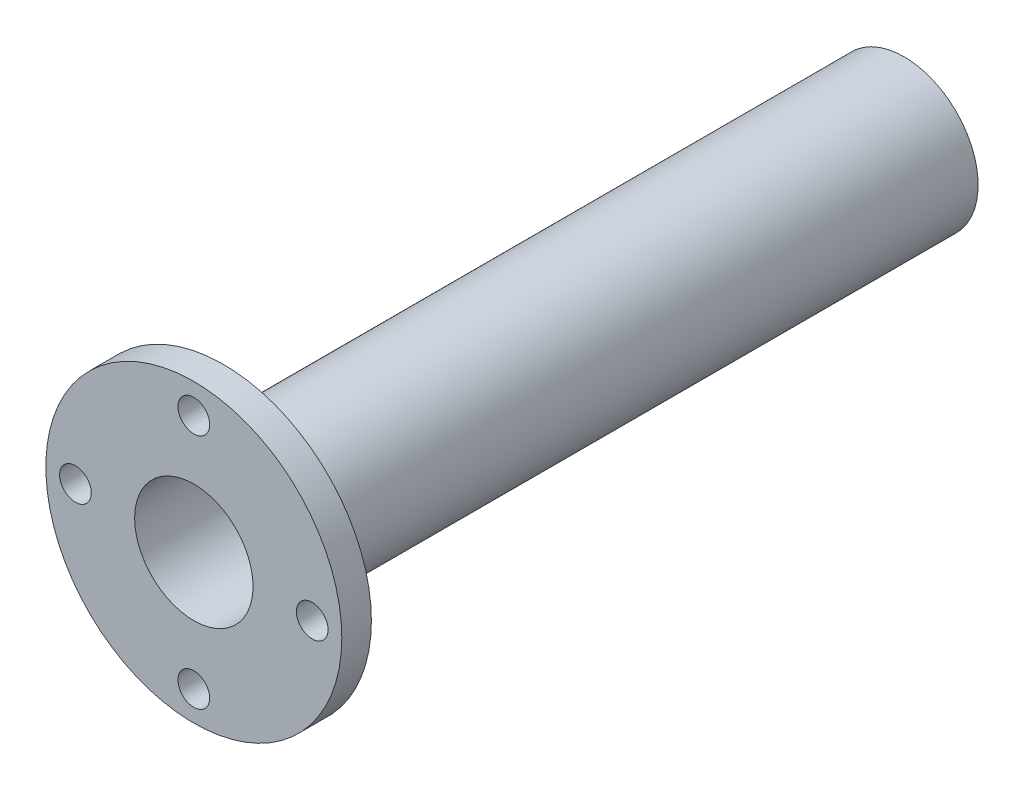
ISO-10303-21;
HEADER;
FILE_DESCRIPTION(('STEP AP214'),'2;1');
FILE_NAME('part.step','',(''),(''),'','','');
FILE_SCHEMA(('AUTOMOTIVE_DESIGN { 1 0 10303 214 1 1 1 1 }'));
ENDSEC;
DATA;
#1=APPLICATION_CONTEXT('core data for automotive mechanical design processes');
#2=APPLICATION_PROTOCOL_DEFINITION('international standard','automotive_design',2000,#1);
#3=PRODUCT_CONTEXT('',#1,'mechanical');
#4=PRODUCT('Part','Part','',(#3));
#5=PRODUCT_RELATED_PRODUCT_CATEGORY('part','',(#4));
#6=PRODUCT_DEFINITION_FORMATION('','',#4);
#7=PRODUCT_DEFINITION_CONTEXT('part definition',#1,'design');
#8=PRODUCT_DEFINITION('design','',#6,#7);
#9=PRODUCT_DEFINITION_SHAPE('','',#8);
#10=(LENGTH_UNIT() NAMED_UNIT(*) SI_UNIT(.MILLI.,.METRE.));
#11=(NAMED_UNIT(*) PLANE_ANGLE_UNIT() SI_UNIT($,.RADIAN.));
#12=(NAMED_UNIT(*) SI_UNIT($,.STERADIAN.) SOLID_ANGLE_UNIT());
#13=UNCERTAINTY_MEASURE_WITH_UNIT(LENGTH_MEASURE(1.E-05),#10,'distance_accuracy_value','');
#14=(GEOMETRIC_REPRESENTATION_CONTEXT(3) GLOBAL_UNCERTAINTY_ASSIGNED_CONTEXT((#13)) GLOBAL_UNIT_ASSIGNED_CONTEXT((#10,
#11,#12)) REPRESENTATION_CONTEXT('',''));
#15=CARTESIAN_POINT('',(0.,0.,0.));
#16=DIRECTION('',(0.,0.,1.));
#17=DIRECTION('',(1.,0.,0.));
#18=AXIS2_PLACEMENT_3D('',#15,#16,#17);
#19=CARTESIAN_POINT('',(0.,0.,76.2));
#20=DIRECTION('',(0.,0.,-1.));
#21=DIRECTION('',(-1.,0.,0.));
#22=AXIS2_PLACEMENT_3D('',#19,#20,#21);
#23=CYLINDRICAL_SURFACE('',#22,7.9375);
#24=CARTESIAN_POINT('',(0.,0.,0.));
#25=DIRECTION('',(0.,0.,1.));
#26=DIRECTION('',(1.,0.,0.));
#27=AXIS2_PLACEMENT_3D('',#24,#25,#26);
#28=CIRCLE('',#27,7.9375);
#29=CARTESIAN_POINT('',(-7.9375,0.,0.));
#30=VERTEX_POINT('',#29);
#31=EDGE_CURVE('E38',#30,#30,#28,.T.);
#32=CARTESIAN_POINT('',(0.,0.,73.025));
#33=DIRECTION('',(0.,0.,1.));
#34=DIRECTION('',(1.,0.,0.));
#35=AXIS2_PLACEMENT_3D('',#32,#33,#34);
#36=CIRCLE('',#35,7.9375);
#37=CARTESIAN_POINT('',(-7.9375,0.,73.025));
#38=VERTEX_POINT('',#37);
#39=EDGE_CURVE('E10',#38,#38,#36,.T.);
#40=CARTESIAN_POINT('',(-7.9375,0.,0.));
#41=CARTESIAN_POINT('',(-7.9375,0.,0.760677083333332));
#42=CARTESIAN_POINT('',(-7.9375,0.,1.52135416666666));
#43=CARTESIAN_POINT('',(-7.9375,0.,3.04270833333333));
#44=CARTESIAN_POINT('',(-7.9375,0.,3.80338541666666));
#45=CARTESIAN_POINT('',(-7.9375,0.,5.32473958333333));
#46=CARTESIAN_POINT('',(-7.9375,0.,6.08541666666667));
#47=CARTESIAN_POINT('',(-7.9375,0.,7.60677083333334));
#48=CARTESIAN_POINT('',(-7.9375,0.,8.36744791666667));
#49=CARTESIAN_POINT('',(-7.9375,0.,9.88880208333333));
#50=CARTESIAN_POINT('',(-7.9375,0.,10.6494791666667));
#51=CARTESIAN_POINT('',(-7.9375,0.,12.1708333333333));
#52=CARTESIAN_POINT('',(-7.9375,0.,12.9315104166667));
#53=CARTESIAN_POINT('',(-7.9375,0.,14.4528645833333));
#54=CARTESIAN_POINT('',(-7.9375,0.,15.2135416666667));
#55=CARTESIAN_POINT('',(-7.9375,0.,16.7348958333333));
#56=CARTESIAN_POINT('',(-7.9375,0.,17.4955729166667));
#57=CARTESIAN_POINT('',(-7.9375,0.,19.0169270833333));
#58=CARTESIAN_POINT('',(-7.9375,0.,19.7776041666667));
#59=CARTESIAN_POINT('',(-7.9375,0.,21.2989583333333));
#60=CARTESIAN_POINT('',(-7.9375,0.,22.0596354166667));
#61=CARTESIAN_POINT('',(-7.9375,0.,23.5809895833333));
#62=CARTESIAN_POINT('',(-7.9375,0.,24.3416666666667));
#63=CARTESIAN_POINT('',(-7.9375,0.,25.8630208333333));
#64=CARTESIAN_POINT('',(-7.9375,0.,26.6236979166667));
#65=CARTESIAN_POINT('',(-7.9375,0.,28.1450520833333));
#66=CARTESIAN_POINT('',(-7.9375,0.,28.9057291666667));
#67=CARTESIAN_POINT('',(-7.9375,0.,30.4270833333333));
#68=CARTESIAN_POINT('',(-7.9375,0.,31.1877604166667));
#69=CARTESIAN_POINT('',(-7.9375,0.,32.7091145833333));
#70=CARTESIAN_POINT('',(-7.9375,0.,33.4697916666667));
#71=CARTESIAN_POINT('',(-7.9375,0.,34.9911458333333));
#72=CARTESIAN_POINT('',(-7.9375,0.,35.7518229166667));
#73=CARTESIAN_POINT('',(-7.9375,0.,37.2731770833333));
#74=CARTESIAN_POINT('',(-7.9375,0.,38.0338541666667));
#75=CARTESIAN_POINT('',(-7.9375,0.,39.5552083333333));
#76=CARTESIAN_POINT('',(-7.9375,0.,40.3158854166667));
#77=CARTESIAN_POINT('',(-7.9375,0.,41.8372395833333));
#78=CARTESIAN_POINT('',(-7.9375,0.,42.5979166666667));
#79=CARTESIAN_POINT('',(-7.9375,0.,44.1192708333333));
#80=CARTESIAN_POINT('',(-7.9375,0.,44.8799479166667));
#81=CARTESIAN_POINT('',(-7.9375,0.,46.4013020833333));
#82=CARTESIAN_POINT('',(-7.9375,0.,47.1619791666667));
#83=CARTESIAN_POINT('',(-7.9375,0.,48.6833333333333));
#84=CARTESIAN_POINT('',(-7.9375,0.,49.4440104166667));
#85=CARTESIAN_POINT('',(-7.9375,0.,50.9653645833333));
#86=CARTESIAN_POINT('',(-7.9375,0.,51.7260416666667));
#87=CARTESIAN_POINT('',(-7.9375,0.,53.2473958333333));
#88=CARTESIAN_POINT('',(-7.9375,0.,54.0080729166667));
#89=CARTESIAN_POINT('',(-7.9375,0.,55.5294270833333));
#90=CARTESIAN_POINT('',(-7.9375,0.,56.2901041666667));
#91=CARTESIAN_POINT('',(-7.9375,0.,57.8114583333333));
#92=CARTESIAN_POINT('',(-7.9375,0.,58.5721354166667));
#93=CARTESIAN_POINT('',(-7.9375,0.,60.0934895833333));
#94=CARTESIAN_POINT('',(-7.9375,0.,60.8541666666667));
#95=CARTESIAN_POINT('',(-7.9375,0.,62.3755208333333));
#96=CARTESIAN_POINT('',(-7.9375,0.,63.1361979166667));
#97=CARTESIAN_POINT('',(-7.9375,0.,64.6575520833333));
#98=CARTESIAN_POINT('',(-7.9375,0.,65.4182291666667));
#99=CARTESIAN_POINT('',(-7.9375,0.,66.9395833333333));
#100=CARTESIAN_POINT('',(-7.9375,0.,67.7002604166667));
#101=CARTESIAN_POINT('',(-7.9375,0.,69.2216145833333));
#102=CARTESIAN_POINT('',(-7.9375,0.,69.9822916666667));
#103=CARTESIAN_POINT('',(-7.9375,0.,71.5036458333333));
#104=CARTESIAN_POINT('',(-7.9375,0.,72.2643229166667));
#105=CARTESIAN_POINT('',(-7.9375,0.,73.025));
#106=B_SPLINE_CURVE_WITH_KNOTS('',3,(#40,#41,#42,#43,#44,#45,#46,#47,#48,#49,#50,#51,#52,#53,
#54,#55,#56,#57,#58,#59,#60,#61,#62,#63,#64,#65,#66,#67,#68,#69,#70,#71,#72,#73,#74,#75,#76,#77,
#78,#79,#80,#81,#82,#83,#84,#85,#86,#87,#88,#89,#90,#91,#92,#93,#94,#95,#96,#97,#98,#99,#100,
#101,#102,#103,#104,#105),.UNSPECIFIED.,.F.,.F.,(4,2,2,2,2,2,2,2,2,2,2,2,2,2,2,2,2,2,2,2,2,2,2,
2,2,2,2,2,2,2,2,2,4),(0.,2.28203125,4.56406249999999,6.84609375,9.128125,11.41015625,13.6921875,
15.97421875,18.25625,20.53828125,22.8203125,25.10234375,27.384375,29.66640625,31.9484375,
34.23046875,36.5125,38.79453125,41.0765625,43.35859375,45.640625,47.92265625,50.2046875,
52.48671875,54.76875,57.05078125,59.3328125,61.61484375,63.896875,66.17890625,68.4609375,
70.74296875,73.025),.UNSPECIFIED.);
#107=EDGE_CURVE('BSEAM31',#30,#38,#106,.T.);
#108=ORIENTED_EDGE('',*,*,#31,.T.);
#109=ORIENTED_EDGE('',*,*,#39,.F.);
#110=ORIENTED_EDGE('',*,*,#107,.T.);
#111=ORIENTED_EDGE('',*,*,#107,.F.);
#112=EDGE_LOOP('',(#108,#110,#109,#111));
#113=FACE_BOUND('',#112,.T.);
#114=ADVANCED_FACE('F31',(#113),#23,.T.);
#115=CARTESIAN_POINT('',(0.,0.,76.2));
#116=DIRECTION('',(0.,0.,1.));
#117=DIRECTION('',(1.,0.,0.));
#118=AXIS2_PLACEMENT_3D('',#115,#116,#117);
#119=PLANE('',#118);
#120=CARTESIAN_POINT('',(0.,12.7,76.2));
#121=DIRECTION('',(0.,0.,1.));
#122=DIRECTION('',(1.,0.,0.));
#123=AXIS2_PLACEMENT_3D('',#120,#121,#122);
#124=CIRCLE('',#123,1.7);
#125=CARTESIAN_POINT('',(1.7,12.7,76.2));
#126=VERTEX_POINT('',#125);
#127=EDGE_CURVE('E71',#126,#126,#124,.T.);
#128=ORIENTED_EDGE('',*,*,#127,.F.);
#129=EDGE_LOOP('',(#128));
#130=FACE_BOUND('',#129,.T.);
#131=CARTESIAN_POINT('',(0.,-12.7,76.2));
#132=DIRECTION('',(0.,0.,1.));
#133=DIRECTION('',(1.,0.,0.));
#134=AXIS2_PLACEMENT_3D('',#131,#132,#133);
#135=CIRCLE('',#134,1.7);
#136=CARTESIAN_POINT('',(1.7,-12.7,76.2));
#137=VERTEX_POINT('',#136);
#138=EDGE_CURVE('E61',#137,#137,#135,.T.);
#139=ORIENTED_EDGE('',*,*,#138,.F.);
#140=EDGE_LOOP('',(#139));
#141=FACE_BOUND('',#140,.T.);
#142=CARTESIAN_POINT('',(12.7,0.,76.2));
#143=DIRECTION('',(0.,0.,1.));
#144=DIRECTION('',(1.,0.,0.));
#145=AXIS2_PLACEMENT_3D('',#142,#143,#144);
#146=CIRCLE('',#145,1.7);
#147=CARTESIAN_POINT('',(14.4,0.,76.2));
#148=VERTEX_POINT('',#147);
#149=EDGE_CURVE('E58',#148,#148,#146,.T.);
#150=ORIENTED_EDGE('',*,*,#149,.F.);
#151=EDGE_LOOP('',(#150));
#152=FACE_BOUND('',#151,.T.);
#153=CARTESIAN_POINT('',(-12.7,0.,76.2));
#154=DIRECTION('',(0.,0.,1.));
#155=DIRECTION('',(1.,0.,0.));
#156=AXIS2_PLACEMENT_3D('',#153,#154,#155);
#157=CIRCLE('',#156,1.7);
#158=CARTESIAN_POINT('',(-11.,0.,76.2));
#159=VERTEX_POINT('',#158);
#160=EDGE_CURVE('E57',#159,#159,#157,.T.);
#161=ORIENTED_EDGE('',*,*,#160,.F.);
#162=EDGE_LOOP('',(#161));
#163=FACE_BOUND('',#162,.T.);
#164=CARTESIAN_POINT('',(0.,0.,76.2));
#165=DIRECTION('',(0.,0.,1.));
#166=DIRECTION('',(1.,0.,0.));
#167=AXIS2_PLACEMENT_3D('',#164,#165,#166);
#168=CIRCLE('',#167,6.35);
#169=CARTESIAN_POINT('',(-6.35,0.,76.2));
#170=VERTEX_POINT('',#169);
#171=EDGE_CURVE('E43',#170,#170,#168,.T.);
#172=ORIENTED_EDGE('',*,*,#171,.F.);
#173=EDGE_LOOP('',(#172));
#174=FACE_BOUND('',#173,.T.);
#175=CARTESIAN_POINT('',(0.,0.,76.2));
#176=DIRECTION('',(0.,0.,1.));
#177=DIRECTION('',(1.,0.,0.));
#178=AXIS2_PLACEMENT_3D('',#175,#176,#177);
#179=CIRCLE('',#178,15.875);
#180=CARTESIAN_POINT('',(15.875,0.,76.2));
#181=VERTEX_POINT('',#180);
#182=EDGE_CURVE('E47',#181,#181,#179,.T.);
#183=ORIENTED_EDGE('',*,*,#182,.T.);
#184=EDGE_LOOP('',(#183));
#185=FACE_BOUND('',#184,.T.);
#186=ADVANCED_FACE('F84',(#130,#141,#152,#163,#174,#185),#119,.T.);
#187=CARTESIAN_POINT('',(0.,0.,0.));
#188=DIRECTION('',(0.,0.,1.));
#189=DIRECTION('',(1.,0.,0.));
#190=AXIS2_PLACEMENT_3D('',#187,#188,#189);
#191=PLANE('',#190);
#192=ORIENTED_EDGE('',*,*,#31,.F.);
#193=EDGE_LOOP('',(#192));
#194=FACE_BOUND('',#193,.T.);
#195=CARTESIAN_POINT('',(0.,0.,0.));
#196=DIRECTION('',(0.,0.,1.));
#197=DIRECTION('',(1.,0.,0.));
#198=AXIS2_PLACEMENT_3D('',#195,#196,#197);
#199=CIRCLE('',#198,6.35);
#200=CARTESIAN_POINT('',(-6.35,0.,0.));
#201=VERTEX_POINT('',#200);
#202=EDGE_CURVE('E51',#201,#201,#199,.T.);
#203=ORIENTED_EDGE('',*,*,#202,.T.);
#204=EDGE_LOOP('',(#203));
#205=FACE_BOUND('',#204,.T.);
#206=ADVANCED_FACE('F109',(#194,#205),#191,.F.);
#207=CARTESIAN_POINT('',(0.,0.,76.2));
#208=DIRECTION('',(0.,0.,-1.));
#209=DIRECTION('',(-1.,0.,0.));
#210=AXIS2_PLACEMENT_3D('',#207,#208,#209);
#211=CYLINDRICAL_SURFACE('',#210,6.35);
#212=CARTESIAN_POINT('',(-6.35,0.,76.2));
#213=CARTESIAN_POINT('',(-6.35,0.,75.40625));
#214=CARTESIAN_POINT('',(-6.35,0.,74.6125));
#215=CARTESIAN_POINT('',(-6.35,0.,73.025));
#216=CARTESIAN_POINT('',(-6.35,0.,72.23125));
#217=CARTESIAN_POINT('',(-6.35,0.,70.64375));
#218=CARTESIAN_POINT('',(-6.35,0.,69.85));
#219=CARTESIAN_POINT('',(-6.35,0.,68.2625));
#220=CARTESIAN_POINT('',(-6.35,0.,67.46875));
#221=CARTESIAN_POINT('',(-6.35,0.,65.88125));
#222=CARTESIAN_POINT('',(-6.35,0.,65.0875));
#223=CARTESIAN_POINT('',(-6.35,0.,63.5));
#224=CARTESIAN_POINT('',(-6.35,0.,62.70625));
#225=CARTESIAN_POINT('',(-6.35,0.,61.11875));
#226=CARTESIAN_POINT('',(-6.35,0.,60.325));
#227=CARTESIAN_POINT('',(-6.35,0.,58.7375));
#228=CARTESIAN_POINT('',(-6.35,0.,57.94375));
#229=CARTESIAN_POINT('',(-6.35,0.,56.35625));
#230=CARTESIAN_POINT('',(-6.35,0.,55.5625));
#231=CARTESIAN_POINT('',(-6.35,0.,53.975));
#232=CARTESIAN_POINT('',(-6.35,0.,53.18125));
#233=CARTESIAN_POINT('',(-6.35,0.,51.59375));
#234=CARTESIAN_POINT('',(-6.35,0.,50.8));
#235=CARTESIAN_POINT('',(-6.35,0.,49.2125));
#236=CARTESIAN_POINT('',(-6.35,0.,48.41875));
#237=CARTESIAN_POINT('',(-6.35,0.,46.83125));
#238=CARTESIAN_POINT('',(-6.35,0.,46.0375));
#239=CARTESIAN_POINT('',(-6.35,0.,44.45));
#240=CARTESIAN_POINT('',(-6.35,0.,43.65625));
#241=CARTESIAN_POINT('',(-6.35,0.,42.06875));
#242=CARTESIAN_POINT('',(-6.35,0.,41.275));
#243=CARTESIAN_POINT('',(-6.35,0.,39.6875));
#244=CARTESIAN_POINT('',(-6.35,0.,38.89375));
#245=CARTESIAN_POINT('',(-6.35,0.,37.30625));
#246=CARTESIAN_POINT('',(-6.35,0.,36.5125));
#247=CARTESIAN_POINT('',(-6.35,0.,34.925));
#248=CARTESIAN_POINT('',(-6.35,0.,34.13125));
#249=CARTESIAN_POINT('',(-6.35,0.,32.54375));
#250=CARTESIAN_POINT('',(-6.35,0.,31.75));
#251=CARTESIAN_POINT('',(-6.35,0.,30.1625));
#252=CARTESIAN_POINT('',(-6.35,0.,29.36875));
#253=CARTESIAN_POINT('',(-6.35,0.,27.78125));
#254=CARTESIAN_POINT('',(-6.35,0.,26.9875));
#255=CARTESIAN_POINT('',(-6.35,0.,25.4));
#256=CARTESIAN_POINT('',(-6.35,0.,24.60625));
#257=CARTESIAN_POINT('',(-6.35,0.,23.01875));
#258=CARTESIAN_POINT('',(-6.35,0.,22.225));
#259=CARTESIAN_POINT('',(-6.35,0.,20.6375));
#260=CARTESIAN_POINT('',(-6.35,0.,19.84375));
#261=CARTESIAN_POINT('',(-6.35,0.,18.25625));
#262=CARTESIAN_POINT('',(-6.35,0.,17.4625));
#263=CARTESIAN_POINT('',(-6.35,0.,15.875));
#264=CARTESIAN_POINT('',(-6.35,0.,15.08125));
#265=CARTESIAN_POINT('',(-6.35,0.,13.49375));
#266=CARTESIAN_POINT('',(-6.35,0.,12.7));
#267=CARTESIAN_POINT('',(-6.35,0.,11.1125));
#268=CARTESIAN_POINT('',(-6.35,0.,10.31875));
#269=CARTESIAN_POINT('',(-6.35,0.,8.73125));
#270=CARTESIAN_POINT('',(-6.35,0.,7.93750000000001));
#271=CARTESIAN_POINT('',(-6.35,0.,6.35));
#272=CARTESIAN_POINT('',(-6.35,0.,5.55625));
#273=CARTESIAN_POINT('',(-6.35,0.,3.96875));
#274=CARTESIAN_POINT('',(-6.35,0.,3.175));
#275=CARTESIAN_POINT('',(-6.35,0.,1.5875));
#276=CARTESIAN_POINT('',(-6.35,0.,0.793750000000001));
#277=CARTESIAN_POINT('',(-6.35,0.,0.));
#278=B_SPLINE_CURVE_WITH_KNOTS('',3,(#212,#213,#214,#215,#216,#217,#218,#219,#220,#221,#222,
#223,#224,#225,#226,#227,#228,#229,#230,#231,#232,#233,#234,#235,#236,#237,#238,#239,#240,#241,
#242,#243,#244,#245,#246,#247,#248,#249,#250,#251,#252,#253,#254,#255,#256,#257,#258,#259,#260,
#261,#262,#263,#264,#265,#266,#267,#268,#269,#270,#271,#272,#273,#274,#275,#276,#277),
.UNSPECIFIED.,.F.,.F.,(4,2,2,2,2,2,2,2,2,2,2,2,2,2,2,2,2,2,2,2,2,2,2,2,2,2,2,2,2,2,2,2,4),(0.,
2.38124999999999,4.76249999999999,7.14374999999999,9.52499999999999,11.90625,14.2875,16.66875,
19.05,21.43125,23.8125,26.19375,28.575,30.95625,33.3375,35.71875,38.1,40.48125,42.8625,45.24375,
47.625,50.00625,52.3875,54.76875,57.15,59.53125,61.9125,64.29375,66.675,69.05625,71.4375,
73.81875,76.2),.UNSPECIFIED.);
#279=EDGE_CURVE('BSEAM99',#170,#201,#278,.T.);
#280=ORIENTED_EDGE('',*,*,#171,.T.);
#281=ORIENTED_EDGE('',*,*,#202,.F.);
#282=ORIENTED_EDGE('',*,*,#279,.T.);
#283=ORIENTED_EDGE('',*,*,#279,.F.);
#284=EDGE_LOOP('',(#280,#282,#281,#283));
#285=FACE_BOUND('',#284,.T.);
#286=ADVANCED_FACE('F99',(#285),#211,.F.);
#287=CARTESIAN_POINT('',(0.,0.,73.025));
#288=DIRECTION('',(0.,0.,1.));
#289=DIRECTION('',(1.,0.,0.));
#290=AXIS2_PLACEMENT_3D('',#287,#288,#289);
#291=PLANE('',#290);
#292=CARTESIAN_POINT('',(0.,12.7,73.025));
#293=DIRECTION('',(0.,0.,1.));
#294=DIRECTION('',(1.,0.,0.));
#295=AXIS2_PLACEMENT_3D('',#292,#293,#294);
#296=CIRCLE('',#295,1.7);
#297=CARTESIAN_POINT('',(1.7,12.7,73.025));
#298=VERTEX_POINT('',#297);
#299=EDGE_CURVE('E34',#298,#298,#296,.T.);
#300=ORIENTED_EDGE('',*,*,#299,.T.);
#301=EDGE_LOOP('',(#300));
#302=FACE_BOUND('',#301,.T.);
#303=CARTESIAN_POINT('',(0.,-12.7,73.025));
#304=DIRECTION('',(0.,0.,1.));
#305=DIRECTION('',(1.,0.,0.));
#306=AXIS2_PLACEMENT_3D('',#303,#304,#305);
#307=CIRCLE('',#306,1.7);
#308=CARTESIAN_POINT('',(1.7,-12.7,73.025));
#309=VERTEX_POINT('',#308);
#310=EDGE_CURVE('E59',#309,#309,#307,.T.);
#311=ORIENTED_EDGE('',*,*,#310,.T.);
#312=EDGE_LOOP('',(#311));
#313=FACE_BOUND('',#312,.T.);
#314=CARTESIAN_POINT('',(12.7,0.,73.025));
#315=DIRECTION('',(0.,0.,1.));
#316=DIRECTION('',(1.,0.,0.));
#317=AXIS2_PLACEMENT_3D('',#314,#315,#316);
#318=CIRCLE('',#317,1.7);
#319=CARTESIAN_POINT('',(14.4,0.,73.025));
#320=VERTEX_POINT('',#319);
#321=EDGE_CURVE('E55',#320,#320,#318,.T.);
#322=ORIENTED_EDGE('',*,*,#321,.T.);
#323=EDGE_LOOP('',(#322));
#324=FACE_BOUND('',#323,.T.);
#325=CARTESIAN_POINT('',(-12.7,0.,73.025));
#326=DIRECTION('',(0.,0.,1.));
#327=DIRECTION('',(1.,0.,0.));
#328=AXIS2_PLACEMENT_3D('',#325,#326,#327);
#329=CIRCLE('',#328,1.7);
#330=CARTESIAN_POINT('',(-11.,0.,73.025));
#331=VERTEX_POINT('',#330);
#332=EDGE_CURVE('E76',#331,#331,#329,.T.);
#333=ORIENTED_EDGE('',*,*,#332,.T.);
#334=EDGE_LOOP('',(#333));
#335=FACE_BOUND('',#334,.T.);
#336=CARTESIAN_POINT('',(0.,0.,73.025));
#337=DIRECTION('',(0.,0.,1.));
#338=DIRECTION('',(1.,0.,0.));
#339=AXIS2_PLACEMENT_3D('',#336,#337,#338);
#340=CIRCLE('',#339,15.875);
#341=CARTESIAN_POINT('',(15.875,0.,73.025));
#342=VERTEX_POINT('',#341);
#343=EDGE_CURVE('E53',#342,#342,#340,.T.);
#344=ORIENTED_EDGE('',*,*,#343,.F.);
#345=EDGE_LOOP('',(#344));
#346=FACE_BOUND('',#345,.T.);
#347=ORIENTED_EDGE('',*,*,#39,.T.);
#348=EDGE_LOOP('',(#347));
#349=FACE_BOUND('',#348,.T.);
#350=ADVANCED_FACE('F89',(#302,#313,#324,#335,#346,#349),#291,.F.);
#351=CARTESIAN_POINT('',(0.,0.,73.025));
#352=DIRECTION('',(0.,0.,1.));
#353=DIRECTION('',(1.,0.,0.));
#354=AXIS2_PLACEMENT_3D('',#351,#352,#353);
#355=CYLINDRICAL_SURFACE('',#354,15.875);
#356=ORIENTED_EDGE('',*,*,#343,.T.);
#357=EDGE_LOOP('',(#356));
#358=FACE_BOUND('',#357,.T.);
#359=ORIENTED_EDGE('',*,*,#182,.F.);
#360=EDGE_LOOP('',(#359));
#361=FACE_BOUND('',#360,.T.);
#362=ADVANCED_FACE('F86',(#358,#361),#355,.T.);
#363=CARTESIAN_POINT('',(-12.7,0.,76.2));
#364=DIRECTION('',(0.,0.,1.));
#365=DIRECTION('',(1.,0.,0.));
#366=AXIS2_PLACEMENT_3D('',#363,#364,#365);
#367=CYLINDRICAL_SURFACE('',#366,1.7);
#368=ORIENTED_EDGE('',*,*,#160,.T.);
#369=EDGE_LOOP('',(#368));
#370=FACE_BOUND('',#369,.T.);
#371=ORIENTED_EDGE('',*,*,#332,.F.);
#372=EDGE_LOOP('',(#371));
#373=FACE_BOUND('',#372,.T.);
#374=ADVANCED_FACE('F88',(#370,#373),#367,.F.);
#375=CARTESIAN_POINT('',(12.7,0.,76.2));
#376=DIRECTION('',(0.,0.,1.));
#377=DIRECTION('',(1.,0.,0.));
#378=AXIS2_PLACEMENT_3D('',#375,#376,#377);
#379=CYLINDRICAL_SURFACE('',#378,1.7);
#380=ORIENTED_EDGE('',*,*,#149,.T.);
#381=EDGE_LOOP('',(#380));
#382=FACE_BOUND('',#381,.T.);
#383=ORIENTED_EDGE('',*,*,#321,.F.);
#384=EDGE_LOOP('',(#383));
#385=FACE_BOUND('',#384,.T.);
#386=ADVANCED_FACE('F95',(#382,#385),#379,.F.);
#387=CARTESIAN_POINT('',(0.,-12.7,76.2));
#388=DIRECTION('',(0.,0.,1.));
#389=DIRECTION('',(1.,0.,0.));
#390=AXIS2_PLACEMENT_3D('',#387,#388,#389);
#391=CYLINDRICAL_SURFACE('',#390,1.7);
#392=ORIENTED_EDGE('',*,*,#138,.T.);
#393=EDGE_LOOP('',(#392));
#394=FACE_BOUND('',#393,.T.);
#395=ORIENTED_EDGE('',*,*,#310,.F.);
#396=EDGE_LOOP('',(#395));
#397=FACE_BOUND('',#396,.T.);
#398=ADVANCED_FACE('F148',(#394,#397),#391,.F.);
#399=CARTESIAN_POINT('',(0.,12.7,76.2));
#400=DIRECTION('',(0.,0.,1.));
#401=DIRECTION('',(1.,0.,0.));
#402=AXIS2_PLACEMENT_3D('',#399,#400,#401);
#403=CYLINDRICAL_SURFACE('',#402,1.7);
#404=ORIENTED_EDGE('',*,*,#127,.T.);
#405=EDGE_LOOP('',(#404));
#406=FACE_BOUND('',#405,.T.);
#407=ORIENTED_EDGE('',*,*,#299,.F.);
#408=EDGE_LOOP('',(#407));
#409=FACE_BOUND('',#408,.T.);
#410=ADVANCED_FACE('F158',(#406,#409),#403,.F.);
#411=CLOSED_SHELL('',(#114,#186,#206,#286,#350,#362,#374,#386,#398,#410));
#412=MANIFOLD_SOLID_BREP('B2',#411);
#413=ADVANCED_BREP_SHAPE_REPRESENTATION('',(#18,#412),#14);
#414=SHAPE_DEFINITION_REPRESENTATION(#9,#413);
ENDSEC;
END-ISO-10303-21;
